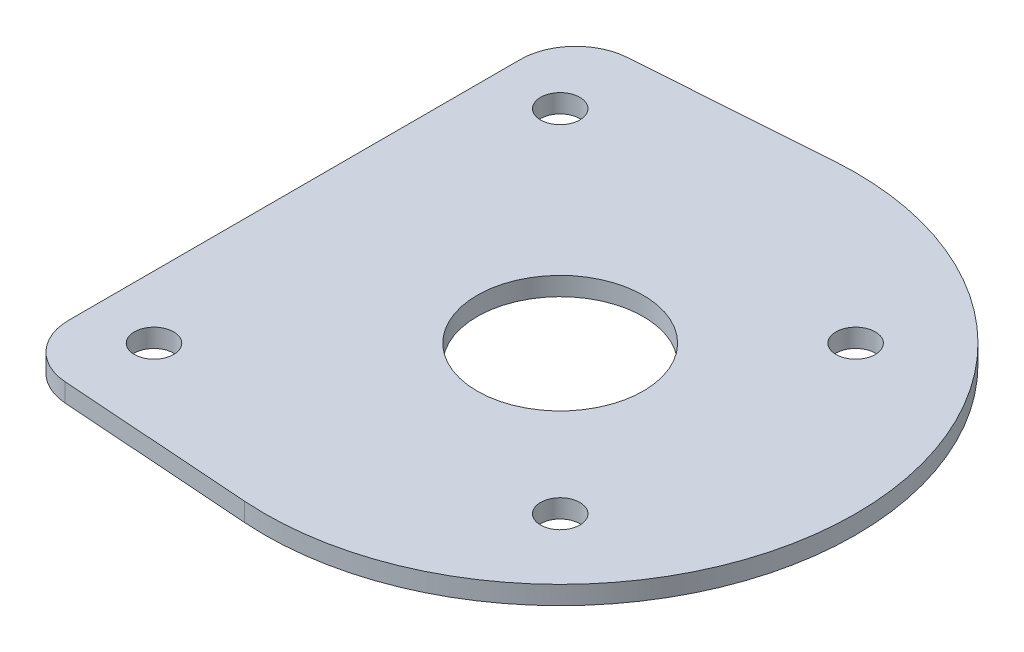
ISO-10303-21;
HEADER;
FILE_DESCRIPTION(('STEP AP214'),'2;1');
FILE_NAME('part.step','',(''),(''),'','','');
FILE_SCHEMA(('AUTOMOTIVE_DESIGN { 1 0 10303 214 1 1 1 1 }'));
ENDSEC;
DATA;
#1=APPLICATION_CONTEXT('core data for automotive mechanical design processes');
#2=APPLICATION_PROTOCOL_DEFINITION('international standard','automotive_design',2000,#1);
#3=PRODUCT_CONTEXT('',#1,'mechanical');
#4=PRODUCT('Part','Part','',(#3));
#5=PRODUCT_RELATED_PRODUCT_CATEGORY('part','',(#4));
#6=PRODUCT_DEFINITION_FORMATION('','',#4);
#7=PRODUCT_DEFINITION_CONTEXT('part definition',#1,'design');
#8=PRODUCT_DEFINITION('design','',#6,#7);
#9=PRODUCT_DEFINITION_SHAPE('','',#8);
#10=(LENGTH_UNIT() NAMED_UNIT(*) SI_UNIT(.MILLI.,.METRE.));
#11=(NAMED_UNIT(*) PLANE_ANGLE_UNIT() SI_UNIT($,.RADIAN.));
#12=(NAMED_UNIT(*) SI_UNIT($,.STERADIAN.) SOLID_ANGLE_UNIT());
#13=UNCERTAINTY_MEASURE_WITH_UNIT(LENGTH_MEASURE(1.E-05),#10,'distance_accuracy_value','');
#14=(GEOMETRIC_REPRESENTATION_CONTEXT(3) GLOBAL_UNCERTAINTY_ASSIGNED_CONTEXT((#13)) GLOBAL_UNIT_ASSIGNED_CONTEXT((#10,
#11,#12)) REPRESENTATION_CONTEXT('',''));
#15=CARTESIAN_POINT('',(0.,0.,0.));
#16=DIRECTION('',(0.,0.,1.));
#17=DIRECTION('',(1.,0.,0.));
#18=AXIS2_PLACEMENT_3D('',#15,#16,#17);
#19=CARTESIAN_POINT('',(89.48928,3.175,0.));
#20=DIRECTION('',(0.,-1.,0.));
#21=DIRECTION('',(0.,0.,-1.));
#22=AXIS2_PLACEMENT_3D('',#19,#20,#21);
#23=PLANE('',#22);
#24=CARTESIAN_POINT('',(54.56428,3.175,-34.925));
#25=DIRECTION('',(0.,1.,0.));
#26=DIRECTION('',(0.,0.,1.));
#27=AXIS2_PLACEMENT_3D('',#24,#25,#26);
#28=CIRCLE('',#27,3.3782);
#29=CARTESIAN_POINT('',(54.56428,3.175,-31.5468));
#30=VERTEX_POINT('',#29);
#31=EDGE_CURVE('E138',#30,#30,#28,.T.);
#32=ORIENTED_EDGE('',*,*,#31,.F.);
#33=EDGE_LOOP('',(#32));
#34=FACE_BOUND('',#33,.T.);
#35=CARTESIAN_POINT('',(54.56428,3.175,34.925));
#36=DIRECTION('',(0.,1.,0.));
#37=DIRECTION('',(0.,0.,1.));
#38=AXIS2_PLACEMENT_3D('',#35,#36,#37);
#39=CIRCLE('',#38,3.3782);
#40=CARTESIAN_POINT('',(54.56428,3.175,38.3032));
#41=VERTEX_POINT('',#40);
#42=EDGE_CURVE('E156',#41,#41,#39,.T.);
#43=ORIENTED_EDGE('',*,*,#42,.F.);
#44=EDGE_LOOP('',(#43));
#45=FACE_BOUND('',#44,.T.);
#46=CARTESIAN_POINT('',(114.88928,3.175,-25.4));
#47=DIRECTION('',(0.,1.,0.));
#48=DIRECTION('',(0.,0.,1.));
#49=AXIS2_PLACEMENT_3D('',#46,#47,#48);
#50=CIRCLE('',#49,3.3782);
#51=CARTESIAN_POINT('',(114.88928,3.175,-22.0218));
#52=VERTEX_POINT('',#51);
#53=EDGE_CURVE('E162',#52,#52,#50,.T.);
#54=ORIENTED_EDGE('',*,*,#53,.F.);
#55=EDGE_LOOP('',(#54));
#56=FACE_BOUND('',#55,.T.);
#57=CARTESIAN_POINT('',(114.88928,3.175,25.4));
#58=DIRECTION('',(0.,1.,0.));
#59=DIRECTION('',(0.,0.,1.));
#60=AXIS2_PLACEMENT_3D('',#57,#58,#59);
#61=CIRCLE('',#60,3.3782);
#62=CARTESIAN_POINT('',(114.88928,3.175,28.7782));
#63=VERTEX_POINT('',#62);
#64=EDGE_CURVE('E168',#63,#63,#61,.T.);
#65=ORIENTED_EDGE('',*,*,#64,.F.);
#66=EDGE_LOOP('',(#65));
#67=FACE_BOUND('',#66,.T.);
#68=DIRECTION('',(0.,0.,-1.));
#69=VECTOR('',#68,1.);
#70=CARTESIAN_POINT('',(43.8149999999999,3.175,-47.6792199572562));
#71=LINE('',#70,#69);
#72=CARTESIAN_POINT('',(43.815,3.175,38.8077345458046));
#73=VERTEX_POINT('',#72);
#74=CARTESIAN_POINT('',(43.8149999999999,3.175,-38.8077345458046));
#75=VERTEX_POINT('',#74);
#76=EDGE_CURVE('E139',#73,#75,#71,.T.);
#77=ORIENTED_EDGE('',*,*,#76,.F.);
#78=CARTESIAN_POINT('',(53.34,3.175,38.8077345458046));
#79=DIRECTION('',(0.,-1.,0.));
#80=DIRECTION('',(0.,0.,-1.));
#81=AXIS2_PLACEMENT_3D('',#78,#79,#80);
#82=CIRCLE('',#81,9.525);
#83=CARTESIAN_POINT('',(52.6641229564032,3.175,48.308724769036));
#84=VERTEX_POINT('',#83);
#85=EDGE_CURVE('E124',#73,#84,#82,.F.);
#86=ORIENTED_EDGE('',*,*,#85,.T.);
#87=DIRECTION('',(0.997479288528233,0.,0.0709582198001818));
#88=VECTOR('',#87,1.);
#89=CARTESIAN_POINT('',(85.8846024341508,3.175,50.6719478572342));
#90=LINE('',#89,#88);
#91=CARTESIAN_POINT('',(85.8846024341508,3.175,50.6719478572342));
#92=VERTEX_POINT('',#91);
#93=EDGE_CURVE('E98',#84,#92,#90,.T.);
#94=ORIENTED_EDGE('',*,*,#93,.T.);
#95=CARTESIAN_POINT('',(89.48928,3.175,0.));
#96=DIRECTION('',(0.,1.,0.));
#97=DIRECTION('',(0.,0.,-1.));
#98=AXIS2_PLACEMENT_3D('',#95,#96,#97);
#99=CIRCLE('',#98,50.8);
#100=CARTESIAN_POINT('',(85.8846024341508,3.175,-50.6719478572342));
#101=VERTEX_POINT('',#100);
#102=EDGE_CURVE('E99',#92,#101,#99,.T.);
#103=ORIENTED_EDGE('',*,*,#102,.T.);
#104=DIRECTION('',(-0.997479288528233,0.,0.0709582198001818));
#105=VECTOR('',#104,1.);
#106=CARTESIAN_POINT('',(85.8846024341508,3.175,-50.6719478572342));
#107=LINE('',#106,#105);
#108=CARTESIAN_POINT('',(52.6641229564032,3.175,-48.308724769036));
#109=VERTEX_POINT('',#108);
#110=EDGE_CURVE('E90',#101,#109,#107,.T.);
#111=ORIENTED_EDGE('',*,*,#110,.T.);
#112=CARTESIAN_POINT('',(53.3399999999999,3.175,-38.8077345458046));
#113=DIRECTION('',(0.,-1.,0.));
#114=DIRECTION('',(0.,0.,-1.));
#115=AXIS2_PLACEMENT_3D('',#112,#113,#114);
#116=CIRCLE('',#115,9.525);
#117=EDGE_CURVE('E122',#109,#75,#116,.F.);
#118=ORIENTED_EDGE('',*,*,#117,.T.);
#119=EDGE_LOOP('',(#77,#86,#94,#103,#111,#118));
#120=FACE_BOUND('',#119,.T.);
#121=CARTESIAN_POINT('',(89.48928,3.175,0.));
#122=DIRECTION('',(0.,1.,0.));
#123=DIRECTION('',(0.,0.,1.));
#124=AXIS2_PLACEMENT_3D('',#121,#122,#123);
#125=CIRCLE('',#124,14.28115);
#126=CARTESIAN_POINT('',(89.48928,3.175,14.28115));
#127=VERTEX_POINT('',#126);
#128=EDGE_CURVE('E147',#127,#127,#125,.T.);
#129=ORIENTED_EDGE('',*,*,#128,.F.);
#130=EDGE_LOOP('',(#129));
#131=FACE_BOUND('',#130,.T.);
#132=ADVANCED_FACE('F35',(#34,#45,#56,#67,#120,#131),#23,.F.);
#133=CARTESIAN_POINT('',(89.48928,0.,0.));
#134=DIRECTION('',(0.,-1.,0.));
#135=DIRECTION('',(0.,0.,-1.));
#136=AXIS2_PLACEMENT_3D('',#133,#134,#135);
#137=PLANE('',#136);
#138=DIRECTION('',(0.997479288528233,0.,0.0709582198001818));
#139=VECTOR('',#138,1.);
#140=CARTESIAN_POINT('',(85.8846024341508,0.,50.6719478572342));
#141=LINE('',#140,#139);
#142=CARTESIAN_POINT('',(52.6641229564032,0.,48.308724769036));
#143=VERTEX_POINT('',#142);
#144=CARTESIAN_POINT('',(85.8846024341508,0.,50.6719478572342));
#145=VERTEX_POINT('',#144);
#146=EDGE_CURVE('E107',#143,#145,#141,.T.);
#147=ORIENTED_EDGE('',*,*,#146,.F.);
#148=CARTESIAN_POINT('',(53.34,0.,38.8077345458046));
#149=DIRECTION('',(0.,-1.,0.));
#150=DIRECTION('',(0.,0.,-1.));
#151=AXIS2_PLACEMENT_3D('',#148,#149,#150);
#152=CIRCLE('',#151,9.525);
#153=CARTESIAN_POINT('',(43.815,0.,38.8077345458046));
#154=VERTEX_POINT('',#153);
#155=EDGE_CURVE('E43',#143,#154,#152,.T.);
#156=ORIENTED_EDGE('',*,*,#155,.T.);
#157=DIRECTION('',(0.,0.,-1.));
#158=VECTOR('',#157,1.);
#159=CARTESIAN_POINT('',(43.8149999999999,0.,-47.6792199572562));
#160=LINE('',#159,#158);
#161=CARTESIAN_POINT('',(43.8149999999999,0.,-38.8077345458046));
#162=VERTEX_POINT('',#161);
#163=EDGE_CURVE('E131',#154,#162,#160,.T.);
#164=ORIENTED_EDGE('',*,*,#163,.T.);
#165=CARTESIAN_POINT('',(53.3399999999999,0.,-38.8077345458046));
#166=DIRECTION('',(0.,-1.,0.));
#167=DIRECTION('',(0.,0.,-1.));
#168=AXIS2_PLACEMENT_3D('',#165,#166,#167);
#169=CIRCLE('',#168,9.525);
#170=CARTESIAN_POINT('',(52.6641229564032,0.,-48.308724769036));
#171=VERTEX_POINT('',#170);
#172=EDGE_CURVE('E50',#162,#171,#169,.T.);
#173=ORIENTED_EDGE('',*,*,#172,.T.);
#174=DIRECTION('',(-0.997479288528233,0.,0.0709582198001818));
#175=VECTOR('',#174,1.);
#176=CARTESIAN_POINT('',(85.8846024341508,0.,-50.6719478572342));
#177=LINE('',#176,#175);
#178=CARTESIAN_POINT('',(85.8846024341508,0.,-50.6719478572342));
#179=VERTEX_POINT('',#178);
#180=EDGE_CURVE('E146',#179,#171,#177,.T.);
#181=ORIENTED_EDGE('',*,*,#180,.F.);
#182=CARTESIAN_POINT('',(89.48928,0.,0.));
#183=DIRECTION('',(0.,1.,0.));
#184=DIRECTION('',(0.,0.,-1.));
#185=AXIS2_PLACEMENT_3D('',#182,#183,#184);
#186=CIRCLE('',#185,50.8);
#187=EDGE_CURVE('E111',#145,#179,#186,.T.);
#188=ORIENTED_EDGE('',*,*,#187,.F.);
#189=EDGE_LOOP('',(#147,#156,#164,#173,#181,#188));
#190=FACE_BOUND('',#189,.T.);
#191=CARTESIAN_POINT('',(54.56428,0.,-34.925));
#192=DIRECTION('',(0.,1.,0.));
#193=DIRECTION('',(0.,0.,1.));
#194=AXIS2_PLACEMENT_3D('',#191,#192,#193);
#195=CIRCLE('',#194,3.3782);
#196=CARTESIAN_POINT('',(54.56428,0.,-31.5468));
#197=VERTEX_POINT('',#196);
#198=EDGE_CURVE('E153',#197,#197,#195,.T.);
#199=ORIENTED_EDGE('',*,*,#198,.T.);
#200=EDGE_LOOP('',(#199));
#201=FACE_BOUND('',#200,.T.);
#202=CARTESIAN_POINT('',(54.56428,0.,34.925));
#203=DIRECTION('',(0.,1.,0.));
#204=DIRECTION('',(0.,0.,1.));
#205=AXIS2_PLACEMENT_3D('',#202,#203,#204);
#206=CIRCLE('',#205,3.3782);
#207=CARTESIAN_POINT('',(54.56428,0.,38.3032));
#208=VERTEX_POINT('',#207);
#209=EDGE_CURVE('E159',#208,#208,#206,.T.);
#210=ORIENTED_EDGE('',*,*,#209,.T.);
#211=EDGE_LOOP('',(#210));
#212=FACE_BOUND('',#211,.T.);
#213=CARTESIAN_POINT('',(114.88928,0.,-25.4));
#214=DIRECTION('',(0.,1.,0.));
#215=DIRECTION('',(0.,0.,1.));
#216=AXIS2_PLACEMENT_3D('',#213,#214,#215);
#217=CIRCLE('',#216,3.3782);
#218=CARTESIAN_POINT('',(114.88928,0.,-22.0218));
#219=VERTEX_POINT('',#218);
#220=EDGE_CURVE('E165',#219,#219,#217,.T.);
#221=ORIENTED_EDGE('',*,*,#220,.T.);
#222=EDGE_LOOP('',(#221));
#223=FACE_BOUND('',#222,.T.);
#224=CARTESIAN_POINT('',(114.88928,0.,25.4));
#225=DIRECTION('',(0.,1.,0.));
#226=DIRECTION('',(0.,0.,1.));
#227=AXIS2_PLACEMENT_3D('',#224,#225,#226);
#228=CIRCLE('',#227,3.3782);
#229=CARTESIAN_POINT('',(114.88928,0.,28.7782));
#230=VERTEX_POINT('',#229);
#231=EDGE_CURVE('E171',#230,#230,#228,.T.);
#232=ORIENTED_EDGE('',*,*,#231,.T.);
#233=EDGE_LOOP('',(#232));
#234=FACE_BOUND('',#233,.T.);
#235=CARTESIAN_POINT('',(89.48928,0.,0.));
#236=DIRECTION('',(0.,1.,0.));
#237=DIRECTION('',(0.,0.,1.));
#238=AXIS2_PLACEMENT_3D('',#235,#236,#237);
#239=CIRCLE('',#238,14.28115);
#240=CARTESIAN_POINT('',(89.48928,0.,14.28115));
#241=VERTEX_POINT('',#240);
#242=EDGE_CURVE('E174',#241,#241,#239,.T.);
#243=ORIENTED_EDGE('',*,*,#242,.T.);
#244=EDGE_LOOP('',(#243));
#245=FACE_BOUND('',#244,.T.);
#246=ADVANCED_FACE('F129',(#190,#201,#212,#223,#234,#245),#137,.T.);
#247=CARTESIAN_POINT('',(89.48928,3.175,0.));
#248=DIRECTION('',(0.,-1.,0.));
#249=DIRECTION('',(0.,0.,-1.));
#250=AXIS2_PLACEMENT_3D('',#247,#248,#249);
#251=CYLINDRICAL_SURFACE('',#250,50.8);
#252=ORIENTED_EDGE('',*,*,#187,.T.);
#253=DIRECTION('',(0.,-1.,0.));
#254=VECTOR('',#253,1.);
#255=CARTESIAN_POINT('',(85.8846024341508,3.175,-50.6719478572342));
#256=LINE('',#255,#254);
#257=EDGE_CURVE('E94',#101,#179,#256,.T.);
#258=ORIENTED_EDGE('',*,*,#257,.F.);
#259=ORIENTED_EDGE('',*,*,#102,.F.);
#260=DIRECTION('',(0.,-1.,0.));
#261=VECTOR('',#260,1.);
#262=CARTESIAN_POINT('',(85.8846024341508,3.175,50.6719478572342));
#263=LINE('',#262,#261);
#264=EDGE_CURVE('E113',#92,#145,#263,.T.);
#265=ORIENTED_EDGE('',*,*,#264,.T.);
#266=EDGE_LOOP('',(#252,#258,#259,#265));
#267=FACE_BOUND('',#266,.T.);
#268=ADVANCED_FACE('F109',(#267),#251,.T.);
#269=CARTESIAN_POINT('',(85.8846024341508,3.175,-50.6719478572342));
#270=DIRECTION('',(0.0709582198001818,0.,0.997479288528233));
#271=DIRECTION('',(0.997479288528233,0.,-0.0709582198001818));
#272=AXIS2_PLACEMENT_3D('',#269,#270,#271);
#273=PLANE('',#272);
#274=ORIENTED_EDGE('',*,*,#180,.T.);
#275=DIRECTION('',(0.,1.,0.));
#276=VECTOR('',#275,1.);
#277=CARTESIAN_POINT('',(52.6641229564032,3.175,-48.308724769036));
#278=LINE('',#277,#276);
#279=EDGE_CURVE('E11',#171,#109,#278,.T.);
#280=ORIENTED_EDGE('',*,*,#279,.T.);
#281=ORIENTED_EDGE('',*,*,#110,.F.);
#282=ORIENTED_EDGE('',*,*,#257,.T.);
#283=EDGE_LOOP('',(#274,#280,#281,#282));
#284=FACE_BOUND('',#283,.T.);
#285=ADVANCED_FACE('F92',(#284),#273,.F.);
#286=CARTESIAN_POINT('',(85.8846024341508,3.175,50.6719478572342));
#287=DIRECTION('',(0.0709582198001818,0.,-0.997479288528233));
#288=DIRECTION('',(-0.997479288528233,0.,-0.0709582198001818));
#289=AXIS2_PLACEMENT_3D('',#286,#287,#288);
#290=PLANE('',#289);
#291=ORIENTED_EDGE('',*,*,#93,.F.);
#292=DIRECTION('',(0.,1.,0.));
#293=VECTOR('',#292,1.);
#294=CARTESIAN_POINT('',(52.6641229564033,3.175,48.308724769036));
#295=LINE('',#294,#293);
#296=EDGE_CURVE('E58',#84,#143,#295,.F.);
#297=ORIENTED_EDGE('',*,*,#296,.T.);
#298=ORIENTED_EDGE('',*,*,#146,.T.);
#299=ORIENTED_EDGE('',*,*,#264,.F.);
#300=EDGE_LOOP('',(#291,#297,#298,#299));
#301=FACE_BOUND('',#300,.T.);
#302=ADVANCED_FACE('F142',(#301),#290,.F.);
#303=CARTESIAN_POINT('',(89.48928,3.175,0.));
#304=DIRECTION('',(0.,-1.,0.));
#305=DIRECTION('',(0.,0.,-1.));
#306=AXIS2_PLACEMENT_3D('',#303,#304,#305);
#307=CYLINDRICAL_SURFACE('',#306,14.28115);
#308=ORIENTED_EDGE('',*,*,#128,.T.);
#309=EDGE_LOOP('',(#308));
#310=FACE_BOUND('',#309,.T.);
#311=ORIENTED_EDGE('',*,*,#242,.F.);
#312=EDGE_LOOP('',(#311));
#313=FACE_BOUND('',#312,.T.);
#314=ADVANCED_FACE('F181',(#310,#313),#307,.F.);
#315=CARTESIAN_POINT('',(114.88928,3.175,25.4));
#316=DIRECTION('',(0.,1.,0.));
#317=DIRECTION('',(0.,0.,1.));
#318=AXIS2_PLACEMENT_3D('',#315,#316,#317);
#319=CYLINDRICAL_SURFACE('',#318,3.3782);
#320=ORIENTED_EDGE('',*,*,#231,.F.);
#321=EDGE_LOOP('',(#320));
#322=FACE_BOUND('',#321,.T.);
#323=ORIENTED_EDGE('',*,*,#64,.T.);
#324=EDGE_LOOP('',(#323));
#325=FACE_BOUND('',#324,.T.);
#326=ADVANCED_FACE('F183',(#322,#325),#319,.F.);
#327=CARTESIAN_POINT('',(114.88928,3.175,-25.4));
#328=DIRECTION('',(0.,1.,0.));
#329=DIRECTION('',(0.,0.,1.));
#330=AXIS2_PLACEMENT_3D('',#327,#328,#329);
#331=CYLINDRICAL_SURFACE('',#330,3.3782);
#332=ORIENTED_EDGE('',*,*,#220,.F.);
#333=EDGE_LOOP('',(#332));
#334=FACE_BOUND('',#333,.T.);
#335=ORIENTED_EDGE('',*,*,#53,.T.);
#336=EDGE_LOOP('',(#335));
#337=FACE_BOUND('',#336,.T.);
#338=ADVANCED_FACE('F190',(#334,#337),#331,.F.);
#339=CARTESIAN_POINT('',(54.56428,3.175,34.925));
#340=DIRECTION('',(0.,1.,0.));
#341=DIRECTION('',(0.,0.,1.));
#342=AXIS2_PLACEMENT_3D('',#339,#340,#341);
#343=CYLINDRICAL_SURFACE('',#342,3.3782);
#344=ORIENTED_EDGE('',*,*,#209,.F.);
#345=EDGE_LOOP('',(#344));
#346=FACE_BOUND('',#345,.T.);
#347=ORIENTED_EDGE('',*,*,#42,.T.);
#348=EDGE_LOOP('',(#347));
#349=FACE_BOUND('',#348,.T.);
#350=ADVANCED_FACE('F217',(#346,#349),#343,.F.);
#351=CARTESIAN_POINT('',(54.56428,3.175,-34.925));
#352=DIRECTION('',(0.,1.,0.));
#353=DIRECTION('',(0.,0.,1.));
#354=AXIS2_PLACEMENT_3D('',#351,#352,#353);
#355=CYLINDRICAL_SURFACE('',#354,3.3782);
#356=ORIENTED_EDGE('',*,*,#198,.F.);
#357=EDGE_LOOP('',(#356));
#358=FACE_BOUND('',#357,.T.);
#359=ORIENTED_EDGE('',*,*,#31,.T.);
#360=EDGE_LOOP('',(#359));
#361=FACE_BOUND('',#360,.T.);
#362=ADVANCED_FACE('F212',(#358,#361),#355,.F.);
#363=CARTESIAN_POINT('',(43.8149999999999,0.,-47.6792199572562));
#364=DIRECTION('',(1.,0.,0.));
#365=DIRECTION('',(0.,0.,-1.));
#366=AXIS2_PLACEMENT_3D('',#363,#364,#365);
#367=PLANE('',#366);
#368=ORIENTED_EDGE('',*,*,#163,.F.);
#369=DIRECTION('',(0.,1.,0.));
#370=VECTOR('',#369,1.);
#371=CARTESIAN_POINT('',(43.815,0.,38.8077345458046));
#372=LINE('',#371,#370);
#373=EDGE_CURVE('E115',#154,#73,#372,.T.);
#374=ORIENTED_EDGE('',*,*,#373,.T.);
#375=ORIENTED_EDGE('',*,*,#76,.T.);
#376=DIRECTION('',(0.,1.,0.));
#377=VECTOR('',#376,1.);
#378=CARTESIAN_POINT('',(43.8149999999999,0.,-38.8077345458046));
#379=LINE('',#378,#377);
#380=EDGE_CURVE('E112',#75,#162,#379,.F.);
#381=ORIENTED_EDGE('',*,*,#380,.T.);
#382=EDGE_LOOP('',(#368,#374,#375,#381));
#383=FACE_BOUND('',#382,.T.);
#384=ADVANCED_FACE('F135',(#383),#367,.F.);
#385=CARTESIAN_POINT('',(53.34,0.,38.8077345458046));
#386=DIRECTION('',(0.,1.,0.));
#387=DIRECTION('',(0.,0.,1.));
#388=AXIS2_PLACEMENT_3D('',#385,#386,#387);
#389=CYLINDRICAL_SURFACE('',#388,9.525);
#390=ORIENTED_EDGE('',*,*,#155,.F.);
#391=ORIENTED_EDGE('',*,*,#296,.F.);
#392=ORIENTED_EDGE('',*,*,#85,.F.);
#393=ORIENTED_EDGE('',*,*,#373,.F.);
#394=EDGE_LOOP('',(#390,#391,#392,#393));
#395=FACE_BOUND('',#394,.T.);
#396=ADVANCED_FACE('F141',(#395),#389,.T.);
#397=CARTESIAN_POINT('',(53.3399999999999,3.175,-38.8077345458046));
#398=DIRECTION('',(0.,1.,0.));
#399=DIRECTION('',(0.,0.,1.));
#400=AXIS2_PLACEMENT_3D('',#397,#398,#399);
#401=CYLINDRICAL_SURFACE('',#400,9.525);
#402=ORIENTED_EDGE('',*,*,#172,.F.);
#403=ORIENTED_EDGE('',*,*,#380,.F.);
#404=ORIENTED_EDGE('',*,*,#117,.F.);
#405=ORIENTED_EDGE('',*,*,#279,.F.);
#406=EDGE_LOOP('',(#402,#403,#404,#405));
#407=FACE_BOUND('',#406,.T.);
#408=ADVANCED_FACE('F37',(#407),#401,.T.);
#409=CLOSED_SHELL('',(#132,#246,#268,#285,#302,#314,#326,#338,#350,#362,#384,#396,#408));
#410=MANIFOLD_SOLID_BREP('B2',#409);
#411=ADVANCED_BREP_SHAPE_REPRESENTATION('',(#18,#410),#14);
#412=SHAPE_DEFINITION_REPRESENTATION(#9,#411);
ENDSEC;
END-ISO-10303-21;
